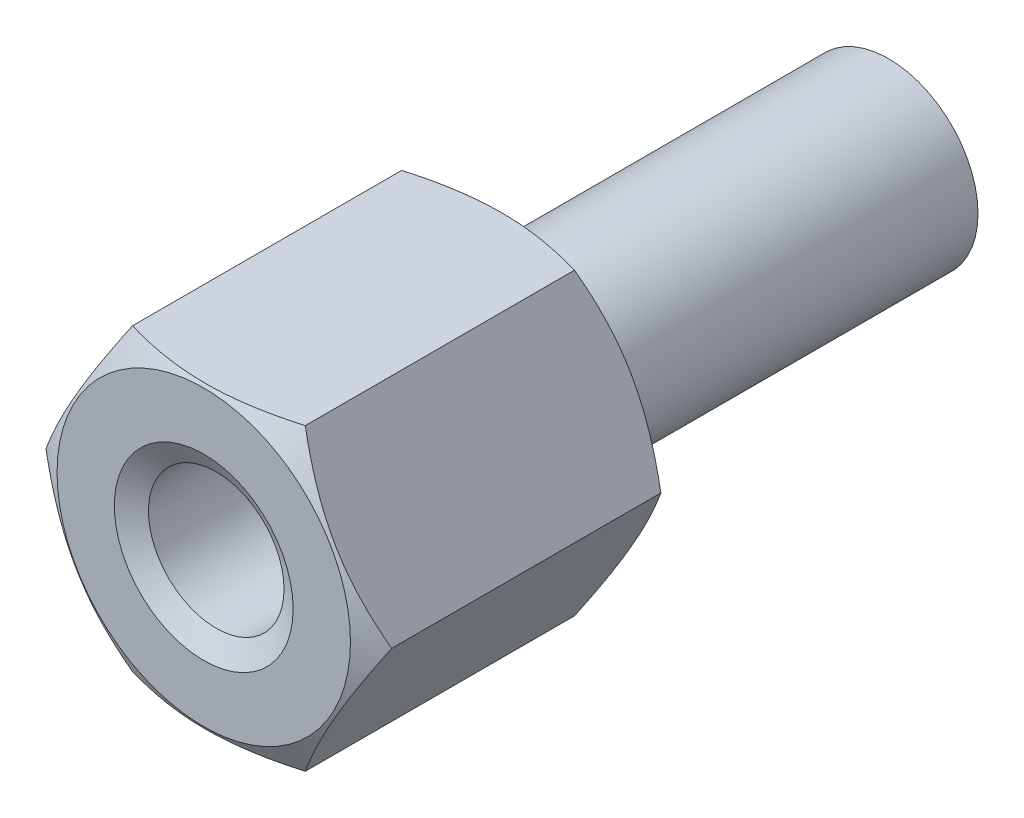
ISO-10303-21;
HEADER;
FILE_DESCRIPTION(('STEP AP214'),'2;1');
FILE_NAME('part.step','',(''),(''),'','','');
FILE_SCHEMA(('AUTOMOTIVE_DESIGN { 1 0 10303 214 1 1 1 1 }'));
ENDSEC;
DATA;
#1=APPLICATION_CONTEXT('core data for automotive mechanical design processes');
#2=APPLICATION_PROTOCOL_DEFINITION('international standard','automotive_design',2000,#1);
#3=PRODUCT_CONTEXT('',#1,'mechanical');
#4=PRODUCT('Part','Part','',(#3));
#5=PRODUCT_RELATED_PRODUCT_CATEGORY('part','',(#4));
#6=PRODUCT_DEFINITION_FORMATION('','',#4);
#7=PRODUCT_DEFINITION_CONTEXT('part definition',#1,'design');
#8=PRODUCT_DEFINITION('design','',#6,#7);
#9=PRODUCT_DEFINITION_SHAPE('','',#8);
#10=(LENGTH_UNIT() NAMED_UNIT(*) SI_UNIT(.MILLI.,.METRE.));
#11=(NAMED_UNIT(*) PLANE_ANGLE_UNIT() SI_UNIT($,.RADIAN.));
#12=(NAMED_UNIT(*) SI_UNIT($,.STERADIAN.) SOLID_ANGLE_UNIT());
#13=UNCERTAINTY_MEASURE_WITH_UNIT(LENGTH_MEASURE(1.E-05),#10,'distance_accuracy_value','');
#14=(GEOMETRIC_REPRESENTATION_CONTEXT(3) GLOBAL_UNCERTAINTY_ASSIGNED_CONTEXT((#13)) GLOBAL_UNIT_ASSIGNED_CONTEXT((#10,
#11,#12)) REPRESENTATION_CONTEXT('',''));
#15=CARTESIAN_POINT('',(0.,0.,0.));
#16=DIRECTION('',(0.,0.,1.));
#17=DIRECTION('',(1.,0.,0.));
#18=AXIS2_PLACEMENT_3D('',#15,#16,#17);
#19=CARTESIAN_POINT('',(0.,0.,1.46067780008253));
#20=DIRECTION('',(0.,0.,1.));
#21=DIRECTION('',(1.,0.,0.));
#22=AXIS2_PLACEMENT_3D('',#19,#20,#21);
#23=CONICAL_SURFACE('',#22,1.07823000007554,1.02974425863595);
#24=CARTESIAN_POINT('',(-5.6843418860808E-11,0.,0.812811854729034));
#25=VERTEX_POINT('',#24);
#26=VERTEX_LOOP('',#25);
#27=FACE_BOUND('',#26,.T.);
#28=CARTESIAN_POINT('',(3.49148133884313E-12,0.,1.46067780000003));
#29=DIRECTION('',(0.,0.,1.));
#30=DIRECTION('',(1.,0.,0.));
#31=AXIS2_PLACEMENT_3D('',#28,#29,#30);
#32=CIRCLE('',#31,1.07823);
#33=CARTESIAN_POINT('',(1.07823000000349,0.,1.46067780000003));
#34=VERTEX_POINT('',#33);
#35=EDGE_CURVE('E230',#34,#34,#32,.T.);
#36=ORIENTED_EDGE('',*,*,#35,.T.);
#37=EDGE_LOOP('',(#36));
#38=FACE_BOUND('',#37,.T.);
#39=ADVANCED_FACE('F17',(#27,#38),#23,.F.);
#40=CARTESIAN_POINT('',(3.49148133884313E-12,0.,1000.));
#41=DIRECTION('',(0.,0.,1.));
#42=DIRECTION('',(1.,0.,0.));
#43=AXIS2_PLACEMENT_3D('',#40,#41,#42);
#44=CYLINDRICAL_SURFACE('',#43,1.07823);
#45=ORIENTED_EDGE('',*,*,#35,.F.);
#46=EDGE_LOOP('',(#45));
#47=FACE_BOUND('',#46,.T.);
#48=CARTESIAN_POINT('',(0.,0.,2.02379335786418));
#49=DIRECTION('',(0.,0.,1.));
#50=DIRECTION('',(1.,0.,0.));
#51=AXIS2_PLACEMENT_3D('',#48,#49,#50);
#52=CIRCLE('',#51,1.07822999996187);
#53=CARTESIAN_POINT('',(1.07822999996188,0.,2.02379335786418));
#54=VERTEX_POINT('',#53);
#55=EDGE_CURVE('E227',#54,#54,#52,.T.);
#56=ORIENTED_EDGE('',*,*,#55,.T.);
#57=EDGE_LOOP('',(#56));
#58=FACE_BOUND('',#57,.T.);
#59=ADVANCED_FACE('F396',(#47,#58),#44,.F.);
#60=CARTESIAN_POINT('',(0.,0.,2.22249999995939));
#61=DIRECTION('',(0.,0.,1.));
#62=DIRECTION('',(1.,0.,0.));
#63=AXIS2_PLACEMENT_3D('',#60,#61,#62);
#64=CONICAL_SURFACE('',#63,1.42239999996718,1.04719755131613);
#65=ORIENTED_EDGE('',*,*,#55,.F.);
#66=EDGE_LOOP('',(#65));
#67=FACE_BOUND('',#66,.T.);
#68=CARTESIAN_POINT('',(0.,0.,2.22250000001622));
#69=DIRECTION('',(0.,0.,-1.));
#70=DIRECTION('',(-1.,0.,0.));
#71=AXIS2_PLACEMENT_3D('',#68,#69,#70);
#72=CIRCLE('',#71,1.42239999996719);
#73=CARTESIAN_POINT('',(-1.42239999996718,0.,2.22250000001623));
#74=VERTEX_POINT('',#73);
#75=EDGE_CURVE('E220',#74,#74,#72,.F.);
#76=ORIENTED_EDGE('',*,*,#75,.T.);
#77=EDGE_LOOP('',(#76));
#78=FACE_BOUND('',#77,.T.);
#79=ADVANCED_FACE('F386',(#67,#78),#64,.F.);
#80=CARTESIAN_POINT('',(0.,0.,2.22250000007306));
#81=DIRECTION('',(0.,0.,-1.));
#82=DIRECTION('',(-1.,0.,0.));
#83=AXIS2_PLACEMENT_3D('',#80,#81,#82);
#84=CONICAL_SURFACE('',#83,1.42239999991035,1.04719755124461);
#85=CARTESIAN_POINT('',(3.49148133884313E-12,0.,2.42120664214696));
#86=DIRECTION('',(0.,0.,1.));
#87=DIRECTION('',(1.,0.,0.));
#88=AXIS2_PLACEMENT_3D('',#85,#86,#87);
#89=CIRCLE('',#88,1.07823000000001);
#90=CARTESIAN_POINT('',(1.0782300000035,0.,2.42120664214696));
#91=VERTEX_POINT('',#90);
#92=EDGE_CURVE('E215',#91,#91,#89,.T.);
#93=ORIENTED_EDGE('',*,*,#92,.T.);
#94=EDGE_LOOP('',(#93));
#95=FACE_BOUND('',#94,.T.);
#96=ORIENTED_EDGE('',*,*,#75,.F.);
#97=EDGE_LOOP('',(#96));
#98=FACE_BOUND('',#97,.T.);
#99=ADVANCED_FACE('F376',(#95,#98),#84,.F.);
#100=CARTESIAN_POINT('',(3.49148133884313E-12,0.,1000.));
#101=DIRECTION('',(0.,0.,1.));
#102=DIRECTION('',(1.,0.,0.));
#103=AXIS2_PLACEMENT_3D('',#100,#101,#102);
#104=CYLINDRICAL_SURFACE('',#103,1.07823000000001);
#105=ORIENTED_EDGE('',*,*,#92,.F.);
#106=EDGE_LOOP('',(#105));
#107=FACE_BOUND('',#106,.T.);
#108=CARTESIAN_POINT('',(0.,0.,4.56379335787461));
#109=DIRECTION('',(0.,0.,1.));
#110=DIRECTION('',(1.,0.,0.));
#111=AXIS2_PLACEMENT_3D('',#108,#109,#110);
#112=CIRCLE('',#111,1.07822999996186);
#113=CARTESIAN_POINT('',(1.07822999996188,0.,4.5637933578746));
#114=VERTEX_POINT('',#113);
#115=EDGE_CURVE('E211',#114,#114,#112,.T.);
#116=ORIENTED_EDGE('',*,*,#115,.T.);
#117=EDGE_LOOP('',(#116));
#118=FACE_BOUND('',#117,.T.);
#119=ADVANCED_FACE('F367',(#107,#118),#104,.F.);
#120=CARTESIAN_POINT('',(0.,0.,4.76250000002665));
#121=DIRECTION('',(0.,0.,1.));
#122=DIRECTION('',(1.,0.,0.));
#123=AXIS2_PLACEMENT_3D('',#120,#121,#122);
#124=CONICAL_SURFACE('',#123,1.42239999996717,1.04719755121142);
#125=ORIENTED_EDGE('',*,*,#115,.F.);
#126=EDGE_LOOP('',(#125));
#127=FACE_BOUND('',#126,.T.);
#128=CARTESIAN_POINT('',(0.,0.,4.76249999996103));
#129=DIRECTION('',(0.,0.,1.));
#130=DIRECTION('',(1.,0.,0.));
#131=AXIS2_PLACEMENT_3D('',#128,#129,#130);
#132=CIRCLE('',#131,1.4223999998535);
#133=CARTESIAN_POINT('',(1.42239999985351,0.,4.76249999996102));
#134=VERTEX_POINT('',#133);
#135=EDGE_CURVE('E20',#134,#134,#132,.F.);
#136=ORIENTED_EDGE('',*,*,#135,.F.);
#137=EDGE_LOOP('',(#136));
#138=FACE_BOUND('',#137,.T.);
#139=ADVANCED_FACE('F359',(#127,#138),#124,.F.);
#140=CARTESIAN_POINT('',(0.,0.,4.7625));
#141=DIRECTION('',(0.,0.,1.));
#142=DIRECTION('',(1.,0.,0.));
#143=AXIS2_PLACEMENT_3D('',#140,#141,#142);
#144=PLANE('',#143);
#145=ORIENTED_EDGE('',*,*,#135,.T.);
#146=EDGE_LOOP('',(#145));
#147=FACE_BOUND('',#146,.T.);
#148=CARTESIAN_POINT('',(0.,0.,4.76249999994342));
#149=DIRECTION('',(0.,0.,-1.));
#150=DIRECTION('',(-1.,0.,0.));
#151=AXIS2_PLACEMENT_3D('',#148,#149,#150);
#152=CIRCLE('',#151,2.33362500006253);
#153=CARTESIAN_POINT('',(-2.33362500006251,0.,4.76249999994342));
#154=VERTEX_POINT('',#153);
#155=EDGE_CURVE('E206',#154,#154,#152,.T.);
#156=ORIENTED_EDGE('',*,*,#155,.F.);
#157=EDGE_LOOP('',(#156));
#158=FACE_BOUND('',#157,.T.);
#159=ADVANCED_FACE('F178',(#147,#158),#144,.T.);
#160=CARTESIAN_POINT('',(0.,0.,4.52087793610189));
#161=DIRECTION('',(0.,0.,-1.));
#162=DIRECTION('',(-1.,0.,0.));
#163=AXIS2_PLACEMENT_3D('',#160,#161,#162);
#164=CONICAL_SURFACE('',#163,2.75212669089343,1.04719755122529);
#165=CARTESIAN_POINT('',(1.37481532850383,-2.38125000000687,4.52231902193078));
#166=CARTESIAN_POINT('',(1.43523013600946,-2.27660848387762,4.55720963851203));
#167=CARTESIAN_POINT('',(1.49616644327393,-2.17106370366993,4.5889408282539));
#168=CARTESIAN_POINT('',(1.61909412920159,-1.95814670598636,4.64432666692431));
#169=CARTESIAN_POINT('',(1.68108769134085,-1.85077070661899,4.66796172458124));
#170=CARTESIAN_POINT('',(1.80430656048059,-1.63734936481778,4.7047513957991));
#171=CARTESIAN_POINT('',(1.8655129139895,-1.53133685079431,4.71815089356114));
#172=CARTESIAN_POINT('',(1.98821346686974,-1.31881325908895,4.73414410611313));
#173=CARTESIAN_POINT('',(2.04970722056393,-1.21230295334249,4.73675106784322));
#174=CARTESIAN_POINT('',(2.16460170245123,-1.01329987320438,4.73131384520457));
#175=CARTESIAN_POINT('',(2.21801967149736,-0.920777236779334,4.72460467921036));
#176=CARTESIAN_POINT('',(2.32450760894597,-0.736334718725136,4.70334486075553));
#177=CARTESIAN_POINT('',(2.37757720931,-0.64441547455726,4.68878695309039));
#178=CARTESIAN_POINT('',(2.48428452195232,-0.459592987521613,4.65239500160878));
#179=CARTESIAN_POINT('',(2.53790873579309,-0.366713124633468,4.63040676666272));
#180=CARTESIAN_POINT('',(2.64435758964818,-0.182338301348986,4.58050276918312));
#181=CARTESIAN_POINT('',(2.69718359234336,-0.0908409807201559,4.55259872457628));
#182=CARTESIAN_POINT('',(2.74963065700989,-9.87708933523013E-12,4.52231902193636));
#183=B_SPLINE_CURVE_WITH_KNOTS('',3,(#165,#166,#167,#168,#169,#170,#171,#172,#173,#174,#175,
#176,#177,#178,#179,#180,#181,#182),.UNSPECIFIED.,.F.,.F.,(4,2,2,2,2,2,2,2,4),(0.,
0.377447188756246,0.755801388390488,1.12479249356597,1.49333055833174,1.81416457868512,
2.13529568072668,2.4635479317661,2.7911559622072),.UNSPECIFIED.);
#184=CARTESIAN_POINT('',(1.37481532850921,-2.38125000000343,4.52231902193095));
#185=VERTEX_POINT('',#184);
#186=CARTESIAN_POINT('',(2.7496306569603,5.98323541491522E-12,4.52231902196218));
#187=VERTEX_POINT('',#186);
#188=EDGE_CURVE('E201',#185,#187,#183,.T.);
#189=ORIENTED_EDGE('',*,*,#188,.T.);
#190=CARTESIAN_POINT('',(2.74963065700994,9.80280419179259E-12,4.52231902193634));
#191=CARTESIAN_POINT('',(2.68921584950446,0.104641516138778,4.55720963851714));
#192=CARTESIAN_POINT('',(2.62827954224015,0.210186296346201,4.58894082825852));
#193=CARTESIAN_POINT('',(2.50535185631282,0.423103294029193,4.64432666692793));
#194=CARTESIAN_POINT('',(2.44335829417374,0.530479293396268,4.66796172458434));
#195=CARTESIAN_POINT('',(2.32013942503435,0.743900635196872,4.70475139580116));
#196=CARTESIAN_POINT('',(2.25893307152561,0.84991314922003,4.71815089356269));
#197=CARTESIAN_POINT('',(2.13623251864575,1.06243674092474,4.73414410611369));
#198=CARTESIAN_POINT('',(2.07473876495176,1.16894704667085,4.7367510678433));
#199=CARTESIAN_POINT('',(1.95984428306451,1.36795012680887,4.73131384520381));
#200=CARTESIAN_POINT('',(1.90642631401823,1.46047276323417,4.7246046792092));
#201=CARTESIAN_POINT('',(1.79993837656934,1.64491528128886,4.70334486075352));
#202=CARTESIAN_POINT('',(1.74686877620518,1.73683452545697,4.68878695308796));
#203=CARTESIAN_POINT('',(1.64016146356259,1.92165701249307,4.6523950016055));
#204=CARTESIAN_POINT('',(1.58653724972169,2.01453687538144,4.63040676665903));
#205=CARTESIAN_POINT('',(1.48008839586636,2.19891169866635,4.58050276917862));
#206=CARTESIAN_POINT('',(1.42726239317105,2.29040901929539,4.5525987245714));
#207=CARTESIAN_POINT('',(1.3748153285044,2.38125000000588,4.52231902193111));
#208=B_SPLINE_CURVE_WITH_KNOTS('',3,(#190,#191,#192,#193,#194,#195,#196,#197,#198,#199,#200,
#201,#202,#203,#204,#205,#206,#207),.UNSPECIFIED.,.F.,.F.,(4,2,2,2,2,2,2,2,4),(0.,
0.377447188754965,0.755801388387895,1.12479249356214,1.4933305583267,1.81416457868104,
2.13529568072357,2.46354793176401,2.7911559622061),.UNSPECIFIED.);
#209=CARTESIAN_POINT('',(1.37481532851006,2.38125000000294,4.52231902193095));
#210=VERTEX_POINT('',#209);
#211=EDGE_CURVE('E159',#187,#210,#208,.T.);
#212=ORIENTED_EDGE('',*,*,#211,.T.);
#213=CARTESIAN_POINT('',(1.37481532851573,2.38125,4.52231902193078));
#214=CARTESIAN_POINT('',(1.25398571350446,2.38125,4.55720963851204));
#215=CARTESIAN_POINT('',(1.13211309897551,2.38125,4.5889408282539));
#216=CARTESIAN_POINT('',(0.886257727120188,2.38125,4.64432666692432));
#217=CARTESIAN_POINT('',(0.762270602841664,2.38125,4.66796172458124));
#218=CARTESIAN_POINT('',(0.51583286456218,2.38125,4.7047513957991));
#219=CARTESIAN_POINT('',(0.393420157544351,2.38125,4.71815089356114));
#220=CARTESIAN_POINT('',(0.148019051783893,2.38125,4.73414410611313));
#221=CARTESIAN_POINT('',(0.0250315443955297,2.38125,4.73675106784322));
#222=CARTESIAN_POINT('',(-0.204757419380657,2.38125,4.73131384520453));
#223=CARTESIAN_POINT('',(-0.311593357474517,2.38125,4.72460467921016));
#224=CARTESIAN_POINT('',(-0.524569232374871,2.38125,4.70334486075478));
#225=CARTESIAN_POINT('',(-0.630708433104492,2.38125,4.68878695308926));
#226=CARTESIAN_POINT('',(-0.844123058392303,2.38125,4.65239500160668));
#227=CARTESIAN_POINT('',(-0.95137148607543,2.38125,4.63040676666004));
#228=CARTESIAN_POINT('',(-1.16426919378873,2.38125,4.58050276917914));
#229=CARTESIAN_POINT('',(-1.26992119918064,2.38125,4.5525987245716));
#230=CARTESIAN_POINT('',(-1.37481532851521,2.38125,4.52231902193093));
#231=B_SPLINE_CURVE_WITH_KNOTS('',3,(#213,#214,#215,#216,#217,#218,#219,#220,#221,#222,#223,
#224,#225,#226,#227,#228,#229,#230),.UNSPECIFIED.,.F.,.F.,(4,2,2,2,2,2,2,2,4),(0.,
0.377447188756264,0.755801388390528,1.12479249356599,1.49333055833174,1.81416457868988,
2.13529568073623,2.46354793178069,2.79115596222678),.UNSPECIFIED.);
#232=CARTESIAN_POINT('',(-1.37481532850966,2.38125000000319,4.52231902193094));
#233=VERTEX_POINT('',#232);
#234=EDGE_CURVE('E167',#210,#233,#231,.T.);
#235=ORIENTED_EDGE('',*,*,#234,.T.);
#236=CARTESIAN_POINT('',(-1.37481532850411,2.38125000000638,4.52231902193094));
#237=CARTESIAN_POINT('',(-1.43523013600974,2.27660848387713,4.55720963851219));
#238=CARTESIAN_POINT('',(-1.49616644327422,2.17106370366943,4.58894082825404));
#239=CARTESIAN_POINT('',(-1.61909412920188,1.95814670598585,4.64432666692443));
#240=CARTESIAN_POINT('',(-1.68108769134114,1.85077070661847,4.66796172458134));
#241=CARTESIAN_POINT('',(-1.80430656048087,1.63734936481727,4.70475139579917));
#242=CARTESIAN_POINT('',(-1.86551291398978,1.53133685079383,4.71815089356119));
#243=CARTESIAN_POINT('',(-1.98821346686999,1.31881325908851,4.73414410611315));
#244=CARTESIAN_POINT('',(-2.04970722056416,1.21230295334208,4.73675106784322));
#245=CARTESIAN_POINT('',(-2.1646017024533,1.01329987320079,4.73131384520445));
#246=CARTESIAN_POINT('',(-2.21801967150128,0.920777236772545,4.72460467920986));
#247=CARTESIAN_POINT('',(-2.32450760895355,0.736334718712006,4.70334486075373));
#248=CARTESIAN_POINT('',(-2.37757720931939,0.644415474540985,4.68878695308769));
#249=CARTESIAN_POINT('',(-2.48428452196539,0.459592987498977,4.65239500160381));
#250=CARTESIAN_POINT('',(-2.53790873580801,0.366713124607618,4.63040676665639));
#251=CARTESIAN_POINT('',(-2.64435758966674,0.182338301316826,4.58050276917375));
#252=CARTESIAN_POINT('',(-2.69718359236371,0.0908409806848994,4.55259872456526));
#253=CARTESIAN_POINT('',(-2.74963065703201,-2.84332365489293E-11,4.52231902192359));
#254=B_SPLINE_CURVE_WITH_KNOTS('',3,(#236,#237,#238,#239,#240,#241,#242,#243,#244,#245,#246,
#247,#248,#249,#250,#251,#252,#253),.UNSPECIFIED.,.F.,.F.,(4,2,2,2,2,2,2,2,4),(0.,
0.377447188756254,0.75580138839051,1.12479249356591,1.4933305583316,1.81416457869607,
2.13529568074878,2.46354793179991,2.79115596225264),.UNSPECIFIED.);
#255=CARTESIAN_POINT('',(-2.74963065707989,-1.1535152173725E-11,4.52231902184508));
#256=VERTEX_POINT('',#255);
#257=EDGE_CURVE('E87',#233,#256,#254,.T.);
#258=ORIENTED_EDGE('',*,*,#257,.T.);
#259=CARTESIAN_POINT('',(-2.74963065701171,2.0348617559065E-11,4.52231902191968));
#260=CARTESIAN_POINT('',(-2.68921584951381,-0.104641516112862,4.55720963850668));
#261=CARTESIAN_POINT('',(-2.62827954225222,-0.210186296322674,4.58894082825114));
#262=CARTESIAN_POINT('',(-2.50535185632611,-0.423103294008789,4.64432666692389));
#263=CARTESIAN_POINT('',(-2.44335829418549,-0.530479293376593,4.66796172458055));
#264=CARTESIAN_POINT('',(-2.32013942504428,-0.743900635178984,4.70475139579847));
#265=CARTESIAN_POINT('',(-2.25893307153522,-0.849913149203186,4.71815089356083));
#266=CARTESIAN_POINT('',(-2.13623251865439,-1.06243674090994,4.73414410611316));
#267=CARTESIAN_POINT('',(-2.07473876495974,-1.16894704665706,4.73675106784326));
#268=CARTESIAN_POINT('',(-1.95984428307127,-1.36795012679712,4.73131384520451));
#269=CARTESIAN_POINT('',(-1.90642631402441,-1.46047276322345,4.72460467921015));
#270=CARTESIAN_POINT('',(-1.79993837657436,-1.64491528128017,4.7033448607548));
#271=CARTESIAN_POINT('',(-1.74686877620961,-1.73683452544928,4.68878695308931));
#272=CARTESIAN_POINT('',(-1.64016146356579,-1.92165701248751,4.65239500160677));
#273=CARTESIAN_POINT('',(-1.58653724972425,-2.014536875377,4.63040676666016));
#274=CARTESIAN_POINT('',(-1.48008839586763,-2.19891169866415,4.5805027691793));
#275=CARTESIAN_POINT('',(-1.42726239317168,-2.2904090192943,4.55259872457176));
#276=CARTESIAN_POINT('',(-1.3748153285044,-2.38125000000588,4.52231902193111));
#277=B_SPLINE_CURVE_WITH_KNOTS('',3,(#259,#260,#261,#262,#263,#264,#265,#266,#267,#268,#269,
#270,#271,#272,#273,#274,#275,#276),.UNSPECIFIED.,.F.,.F.,(4,2,2,2,2,2,2,2,4),(0.,
0.377447188759317,0.755801388396387,1.12479249357414,1.49333055834229,1.81416457870009,
2.13529568074604,2.46354793179036,2.7911559622364),.UNSPECIFIED.);
#278=CARTESIAN_POINT('',(-1.37481532851006,-2.38125000000294,4.52231902193095));
#279=VERTEX_POINT('',#278);
#280=EDGE_CURVE('E88',#256,#279,#277,.T.);
#281=ORIENTED_EDGE('',*,*,#280,.T.);
#282=CARTESIAN_POINT('',(-1.37481532851572,-2.38125,4.52231902193078));
#283=CARTESIAN_POINT('',(-1.25398571350445,-2.38125,4.55720963851204));
#284=CARTESIAN_POINT('',(-1.1321130989755,-2.38125,4.5889408282539));
#285=CARTESIAN_POINT('',(-0.886257727120183,-2.38125,4.64432666692432));
#286=CARTESIAN_POINT('',(-0.762270602841659,-2.38125,4.66796172458124));
#287=CARTESIAN_POINT('',(-0.515832864562174,-2.38125,4.7047513957991));
#288=CARTESIAN_POINT('',(-0.393420157544344,-2.38125,4.71815089356114));
#289=CARTESIAN_POINT('',(-0.148019051783884,-2.38125,4.73414410611313));
#290=CARTESIAN_POINT('',(-0.02503154439552,-2.38125,4.73675106784322));
#291=CARTESIAN_POINT('',(0.204757419380613,-2.38125,4.73131384520453));
#292=CARTESIAN_POINT('',(0.31159335747442,-2.38125,4.72460467921017));
#293=CARTESIAN_POINT('',(0.524569232374666,-2.38125,4.7033448607548));
#294=CARTESIAN_POINT('',(0.630708433104234,-2.38125,4.68878695308929));
#295=CARTESIAN_POINT('',(0.844123058391937,-2.38125,4.65239500160675));
#296=CARTESIAN_POINT('',(0.95137148607501,-2.38125,4.63040676666013));
#297=CARTESIAN_POINT('',(1.16426919378821,-2.38125,4.58050276917927));
#298=CARTESIAN_POINT('',(1.26992119918006,-2.38125,4.55259872457175));
#299=CARTESIAN_POINT('',(1.37481532851458,-2.38125,4.52231902193111));
#300=B_SPLINE_CURVE_WITH_KNOTS('',3,(#282,#283,#284,#285,#286,#287,#288,#289,#290,#291,#292,
#293,#294,#295,#296,#297,#298,#299),.UNSPECIFIED.,.F.,.F.,(4,2,2,2,2,2,2,2,4),(0.,
0.377447188756265,0.755801388390531,1.12479249356599,1.49333055833175,1.81416457868973,
2.13529568073592,2.4635479317802,2.79115596222612),.UNSPECIFIED.);
#301=EDGE_CURVE('E63',#279,#185,#300,.T.);
#302=ORIENTED_EDGE('',*,*,#301,.T.);
#303=EDGE_LOOP('',(#189,#212,#235,#258,#281,#302));
#304=FACE_BOUND('',#303,.T.);
#305=ORIENTED_EDGE('',*,*,#155,.T.);
#306=EDGE_LOOP('',(#305));
#307=FACE_BOUND('',#306,.T.);
#308=ADVANCED_FACE('F173',(#304,#307),#164,.T.);
#309=CARTESIAN_POINT('',(1.3748153285078,-2.38125,4.7625));
#310=DIRECTION('',(-0.866025403784439,0.5,0.));
#311=DIRECTION('',(-0.5,-0.866025403784439,0.));
#312=AXIS2_PLACEMENT_3D('',#309,#310,#311);
#313=PLANE('',#312);
#314=DIRECTION('',(0.,0.,1.));
#315=VECTOR('',#314,1.);
#316=CARTESIAN_POINT('',(2.74963065701099,7.97753497567421E-12,4.7625));
#317=LINE('',#316,#315);
#318=CARTESIAN_POINT('',(2.74963065700102,1.99438373859621E-12,0.240180978016528));
#319=VERTEX_POINT('',#318);
#320=EDGE_CURVE('E166',#319,#187,#317,.T.);
#321=ORIENTED_EDGE('',*,*,#320,.T.);
#322=ORIENTED_EDGE('',*,*,#188,.F.);
#323=DIRECTION('',(0.,0.,1.));
#324=VECTOR('',#323,1.);
#325=CARTESIAN_POINT('',(1.37481532850532,-2.38125,4.7625));
#326=LINE('',#325,#324);
#327=CARTESIAN_POINT('',(1.37481537617074,-2.38125,0.240180991819275));
#328=VERTEX_POINT('',#327);
#329=EDGE_CURVE('E223',#185,#328,#326,.F.);
#330=ORIENTED_EDGE('',*,*,#329,.T.);
#331=CARTESIAN_POINT('',(2.74963065698386,-2.23408346329614E-11,0.240180978060676));
#332=CARTESIAN_POINT('',(2.68921584950525,-0.104641516125692,0.205290361481467));
#333=CARTESIAN_POINT('',(2.62827954226212,-0.210186296304998,0.173559171744014));
#334=CARTESIAN_POINT('',(2.50535185637474,-0.423103293925097,0.118173333082303));
#335=CARTESIAN_POINT('',(2.44335829425443,-0.530479293257331,0.0945382754293683));
#336=CARTESIAN_POINT('',(2.32013942511602,-0.743900635054584,0.0577486042002292));
#337=CARTESIAN_POINT('',(2.25893307158898,-0.849913149110041,0.0443491064290708));
#338=CARTESIAN_POINT('',(2.13623251866887,-1.0624367408849,0.0283558938674659));
#339=CARTESIAN_POINT('',(2.07473876495293,-1.16894704666887,0.0257489321371782));
#340=CARTESIAN_POINT('',(1.95984428762125,-1.36795011891632,0.0311861545607302));
#341=CARTESIAN_POINT('',(1.90642632314264,-1.46047274743021,0.0378953196220076));
#342=CARTESIAN_POINT('',(1.79993839475328,-1.64491524979337,0.0591551349254881));
#343=CARTESIAN_POINT('',(1.74686879888078,-1.73683448618167,0.0737130403691414));
#344=CARTESIAN_POINT('',(1.64016149532538,-1.92165695747829,0.110104986310912));
#345=CARTESIAN_POINT('',(1.58653728607556,-2.01453681241469,0.13209321789847));
#346=CARTESIAN_POINT('',(1.48008844123541,-2.19891162008485,0.181997207930283));
#347=CARTESIAN_POINT('',(1.42726244296482,-2.29040893305006,0.209901248452271));
#348=CARTESIAN_POINT('',(1.37481538266088,-2.38124990620411,0.240180946794873));
#349=B_SPLINE_CURVE_WITH_KNOTS('',3,(#331,#332,#333,#334,#335,#336,#337,#338,#339,#340,#341,
#342,#343,#344,#345,#346,#347,#348),.UNSPECIFIED.,.F.,.F.,(4,2,2,2,2,2,2,2,4),(0.,
0.377447188650636,0.755801388164953,1.12479249345407,1.49333055834378,1.8141645512535,
2.13529562574983,2.46354784781481,2.79115584950207),.UNSPECIFIED.);
#350=EDGE_CURVE('E35',#319,#328,#349,.T.);
#351=ORIENTED_EDGE('',*,*,#350,.F.);
#352=EDGE_LOOP('',(#321,#322,#330,#351));
#353=FACE_BOUND('',#352,.T.);
#354=ADVANCED_FACE('F177',(#353),#313,.F.);
#355=CARTESIAN_POINT('',(-1.37481532850779,-2.38125,4.7625));
#356=DIRECTION('',(0.,1.,0.));
#357=DIRECTION('',(-1.,0.,0.));
#358=AXIS2_PLACEMENT_3D('',#355,#356,#357);
#359=PLANE('',#358);
#360=ORIENTED_EDGE('',*,*,#329,.F.);
#361=ORIENTED_EDGE('',*,*,#301,.F.);
#362=DIRECTION('',(0.,0.,1.));
#363=VECTOR('',#362,1.);
#364=CARTESIAN_POINT('',(-1.37481532850903,-2.38124999999785,4.7625));
#365=LINE('',#364,#363);
#366=CARTESIAN_POINT('',(-1.37481530469018,-2.38125004125331,0.240180991811282));
#367=VERTEX_POINT('',#366);
#368=EDGE_CURVE('E82',#279,#367,#365,.F.);
#369=ORIENTED_EDGE('',*,*,#368,.T.);
#370=CARTESIAN_POINT('',(1.37481542383616,-2.38125,0.240181005579098));
#371=CARTESIAN_POINT('',(1.25398580728187,-2.38125,0.205290386754302));
#372=CARTESIAN_POINT('',(1.13211319120023,-2.38125,0.173559194625385));
#373=CARTESIAN_POINT('',(0.886257816090579,-2.38125,0.118173350992264));
#374=CARTESIAN_POINT('',(0.762270690109504,-2.38125,0.0945382907622425));
#375=CARTESIAN_POINT('',(0.515832948351923,-2.38125,0.0577486144221395));
#376=CARTESIAN_POINT('',(0.393420239563842,-2.38125,0.0443491141069867));
#377=CARTESIAN_POINT('',(0.148019130053474,-2.38125,0.0283558966340724));
#378=CARTESIAN_POINT('',(0.025031620685819,-2.38125,0.0257489325346501));
#379=CARTESIAN_POINT('',(-0.204757342072546,-2.38125,0.0311861510243268));
#380=CARTESIAN_POINT('',(-0.311593277156512,-2.38125,0.0378953148048352));
#381=CARTESIAN_POINT('',(-0.524569146208676,-2.38125,0.0591551285716584));
#382=CARTESIAN_POINT('',(-0.630708344100228,-2.38125,0.0737130337616674));
#383=CARTESIAN_POINT('',(-0.844122963722691,-2.38125,0.110104980141274));
#384=CARTESIAN_POINT('',(-0.951371388582829,-2.38125,0.132093212453365));
#385=CARTESIAN_POINT('',(-1.16426909078817,-2.38125,0.181997204690385));
#386=CARTESIAN_POINT('',(-1.26992109349456,-2.38125,0.20990124669001));
#387=CARTESIAN_POINT('',(-1.3748152201705,-2.38125,0.240180946785896));
#388=B_SPLINE_CURVE_WITH_KNOTS('',3,(#370,#371,#372,#373,#374,#375,#376,#377,#378,#379,#380,
#381,#382,#383,#384,#385,#386,#387),.UNSPECIFIED.,.F.,.F.,(4,2,2,2,2,2,2,2,4),(0.,
0.377447195080435,0.755801401191275,1.12479251248186,1.49333058331065,1.81416459426107,
2.13529568686784,2.46354792802463,2.79115594868164),.UNSPECIFIED.);
#389=EDGE_CURVE('E86',#328,#367,#388,.T.);
#390=ORIENTED_EDGE('',*,*,#389,.F.);
#391=EDGE_LOOP('',(#360,#361,#369,#390));
#392=FACE_BOUND('',#391,.T.);
#393=ADVANCED_FACE('F84',(#392),#359,.F.);
#394=CARTESIAN_POINT('',(-2.74963065701559,0.,4.7625));
#395=DIRECTION('',(0.866025403784438,0.5,0.));
#396=DIRECTION('',(-0.5,0.866025403784438,0.));
#397=AXIS2_PLACEMENT_3D('',#394,#395,#396);
#398=PLANE('',#397);
#399=ORIENTED_EDGE('',*,*,#368,.F.);
#400=ORIENTED_EDGE('',*,*,#280,.F.);
#401=DIRECTION('',(0.,0.,1.));
#402=VECTOR('',#401,1.);
#403=CARTESIAN_POINT('',(-2.74963065704223,-4.61406086949001E-11,4.7625));
#404=LINE('',#403,#402);
#405=CARTESIAN_POINT('',(-2.74963065696952,-3.46053723397896E-11,0.2401809779872));
#406=VERTEX_POINT('',#405);
#407=EDGE_CURVE('E76',#256,#406,#404,.F.);
#408=ORIENTED_EDGE('',*,*,#407,.T.);
#409=CARTESIAN_POINT('',(-1.37481528087133,-2.38125008250877,0.240181005563102));
#410=CARTESIAN_POINT('',(-1.43523008916562,-2.27660856501354,0.205290386729582));
#411=CARTESIAN_POINT('',(-1.49616639722379,-2.17106378343112,0.173559194593712));
#412=CARTESIAN_POINT('',(-1.61909408481606,-1.95814678286435,0.118173350951022));
#413=CARTESIAN_POINT('',(-1.68108764782672,-1.85077078198766,0.0945382907186937));
#414=CARTESIAN_POINT('',(-1.80430651870761,-1.63734943717069,0.0577486143933438));
#415=CARTESIAN_POINT('',(-1.86551287308314,-1.53133692164621,0.0443491140890688));
#416=CARTESIAN_POINT('',(-1.98821342779798,-1.31881332676321,0.0283558966302994));
#417=CARTESIAN_POINT('',(-2.04970718245997,-1.21230301934047,0.0257489325338524));
#418=CARTESIAN_POINT('',(-2.16460166839063,-1.01329993219907,0.0311861512440728));
#419=CARTESIAN_POINT('',(-2.21801964049612,-0.920777290475057,0.0378953159595284));
#420=CARTESIAN_POINT('',(-2.32450758407336,-0.736334761805752,0.0591551328808915));
#421=CARTESIAN_POINT('',(-2.3775771875066,-0.644415512321846,0.0737130402935377));
#422=CARTESIAN_POINT('',(-2.48428450639662,-0.459593014464889,0.110104992214536));
#423=CARTESIAN_POINT('',(-2.53790872341354,-0.366713146075469,0.132093227885504));
#424=CARTESIAN_POINT('',(-2.64435758352303,-0.182338311958045,0.181997227570428));
#425=CARTESIAN_POINT('',(-2.69718358929679,-0.090840985996973,0.209901273654637));
#426=CARTESIAN_POINT('',(-2.74963065699333,-3.85487186439722E-11,0.240180978047333));
#427=B_SPLINE_CURVE_WITH_KNOTS('',3,(#409,#410,#411,#412,#413,#414,#415,#416,#417,#418,#419,
#420,#421,#422,#423,#424,#425,#426),.UNSPECIFIED.,.F.,.F.,(4,2,2,2,2,2,2,2,4),(0.,
0.377447195186261,0.755801401416903,1.12479251259253,1.49333058329618,1.81416462166671,
2.13529574179504,2.46354801190253,2.7911560612898),.UNSPECIFIED.);
#428=EDGE_CURVE('E90',#367,#406,#427,.T.);
#429=ORIENTED_EDGE('',*,*,#428,.F.);
#430=EDGE_LOOP('',(#399,#400,#408,#429));
#431=FACE_BOUND('',#430,.T.);
#432=ADVANCED_FACE('F91',(#431),#398,.F.);
#433=CARTESIAN_POINT('',(-1.37481532850779,2.38125,4.7625));
#434=DIRECTION('',(0.866025403784439,-0.5,0.));
#435=DIRECTION('',(0.5,0.866025403784439,0.));
#436=AXIS2_PLACEMENT_3D('',#433,#434,#435);
#437=PLANE('',#436);
#438=ORIENTED_EDGE('',*,*,#407,.F.);
#439=ORIENTED_EDGE('',*,*,#257,.F.);
#440=DIRECTION('',(0.,0.,1.));
#441=VECTOR('',#440,1.);
#442=CARTESIAN_POINT('',(-1.37481532850614,2.38125,4.7625));
#443=LINE('',#442,#441);
#444=CARTESIAN_POINT('',(-1.37481537615582,2.38125,0.240180991814977));
#445=VERTEX_POINT('',#444);
#446=EDGE_CURVE('E462',#233,#445,#443,.F.);
#447=ORIENTED_EDGE('',*,*,#446,.T.);
#448=CARTESIAN_POINT('',(-2.7496306569778,3.35873109735827E-11,0.240180978056761));
#449=CARTESIAN_POINT('',(-2.68921584949908,0.10464151613664,0.205290361478011));
#450=CARTESIAN_POINT('',(-2.62827954225598,0.210186296315698,0.173559171740948));
#451=CARTESIAN_POINT('',(-2.50535185636878,0.42310329393533,0.118173333079959));
#452=CARTESIAN_POINT('',(-2.44335829424864,0.530479293267344,0.0945382754273561));
#453=CARTESIAN_POINT('',(-2.3201394251105,0.743900635064167,0.0577486041988874));
#454=CARTESIAN_POINT('',(-2.25893307158357,0.849913149119412,0.0443491064280699));
#455=CARTESIAN_POINT('',(-2.13623251866371,1.06243674089383,0.0283558938671168));
#456=CARTESIAN_POINT('',(-2.07473876494791,1.16894704667757,0.0257489321371402));
#457=CARTESIAN_POINT('',(-1.95984428761787,1.36795011892216,0.0311861545611547));
#458=CARTESIAN_POINT('',(-1.90642632314078,1.46047274743343,0.0378953196223739));
#459=CARTESIAN_POINT('',(-1.79993839475442,1.64491524979139,0.0591551349252906));
#460=CARTESIAN_POINT('',(-1.74686879888341,1.73683448617711,0.0737130403684373));
#461=CARTESIAN_POINT('',(-1.64016149533104,1.92165695746849,0.110104986308805));
#462=CARTESIAN_POINT('',(-1.58653728608275,2.01453681240223,0.132093217895451));
#463=CARTESIAN_POINT('',(-1.48008844124561,2.19891162006717,0.181997207925164));
#464=CARTESIAN_POINT('',(-1.4272624429765,2.29040893302982,0.209901248445965));
#465=CARTESIAN_POINT('',(-1.37481538267402,2.38124990618134,0.240180946787293));
#466=B_SPLINE_CURVE_WITH_KNOTS('',3,(#448,#449,#450,#451,#452,#453,#454,#455,#456,#457,#458,
#459,#460,#461,#462,#463,#464,#465),.UNSPECIFIED.,.F.,.F.,(4,2,2,2,2,2,2,2,4),(0.,
0.377447188649676,0.755801388163017,1.12479249345131,1.4933305583402,1.81416455124088,
2.13529562572816,2.46354784778359,2.79115584946137),.UNSPECIFIED.);
#467=EDGE_CURVE('E95',#406,#445,#466,.T.);
#468=ORIENTED_EDGE('',*,*,#467,.F.);
#469=EDGE_LOOP('',(#438,#439,#447,#468));
#470=FACE_BOUND('',#469,.T.);
#471=ADVANCED_FACE('F315',(#470),#437,.F.);
#472=CARTESIAN_POINT('',(1.3748153285078,2.38125,4.7625));
#473=DIRECTION('',(0.,-1.,0.));
#474=DIRECTION('',(1.,0.,0.));
#475=AXIS2_PLACEMENT_3D('',#472,#473,#474);
#476=PLANE('',#475);
#477=ORIENTED_EDGE('',*,*,#446,.F.);
#478=ORIENTED_EDGE('',*,*,#234,.F.);
#479=DIRECTION('',(0.,0.,1.));
#480=VECTOR('',#479,1.);
#481=CARTESIAN_POINT('',(1.37481532850904,2.38124999999786,4.7625));
#482=LINE('',#481,#480);
#483=CARTESIAN_POINT('',(1.37481530469013,2.38125004125341,0.240180991811304));
#484=VERTEX_POINT('',#483);
#485=EDGE_CURVE('E101',#210,#484,#482,.F.);
#486=ORIENTED_EDGE('',*,*,#485,.T.);
#487=CARTESIAN_POINT('',(-1.37481542380549,2.38125,0.240181005570254));
#488=CARTESIAN_POINT('',(-1.2539858072517,2.38125,0.205290386746181));
#489=CARTESIAN_POINT('',(-1.13211319117058,2.38125,0.173559194618033));
#490=CARTESIAN_POINT('',(-0.886257816061999,2.38125,0.118173350986511));
#491=CARTESIAN_POINT('',(-0.762270690081486,2.38125,0.0945382907573167));
#492=CARTESIAN_POINT('',(-0.515832948325025,2.38125,0.0577486144188556));
#493=CARTESIAN_POINT('',(-0.393420239537501,2.38125,0.0443491141045202));
#494=CARTESIAN_POINT('',(-0.148019130028314,2.38125,0.0283558966331836));
#495=CARTESIAN_POINT('',(-0.0250316206612824,2.38125,0.0257489325345223));
#496=CARTESIAN_POINT('',(0.20475734209447,2.38125,0.0311861510254622));
#497=CARTESIAN_POINT('',(0.311593277176457,2.38125,0.0378953148063809));
#498=CARTESIAN_POINT('',(0.524569146224656,2.38125,0.0591551285736935));
#499=CARTESIAN_POINT('',(0.630708344114222,2.38125,0.0737130337637809));
#500=CARTESIAN_POINT('',(0.844122963732643,2.38125,0.110104980143239));
#501=CARTESIAN_POINT('',(0.951371388590728,2.38125,0.132093212455093));
#502=CARTESIAN_POINT('',(1.16426909079202,2.38125,0.181997204691395));
#503=CARTESIAN_POINT('',(1.26992109349642,2.38125,0.20990124669054));
#504=CARTESIAN_POINT('',(1.3748152201704,2.38125,0.240180946785857));
#505=B_SPLINE_CURVE_WITH_KNOTS('',3,(#487,#488,#489,#490,#491,#492,#493,#494,#495,#496,#497,
#498,#499,#500,#501,#502,#503,#504),.UNSPECIFIED.,.F.,.F.,(4,2,2,2,2,2,2,2,4),(0.,
0.377447195078366,0.755801401187084,1.12479251247574,1.49333058330262,1.81416459424721,
2.13529568684813,2.46354792799875,2.79115594864963),.UNSPECIFIED.);
#506=EDGE_CURVE('E133',#445,#484,#505,.T.);
#507=ORIENTED_EDGE('',*,*,#506,.F.);
#508=EDGE_LOOP('',(#477,#478,#486,#507));
#509=FACE_BOUND('',#508,.T.);
#510=ADVANCED_FACE('F154',(#509),#476,.F.);
#511=CARTESIAN_POINT('',(2.7496306570156,0.,4.7625));
#512=DIRECTION('',(-0.866025403784438,-0.5,0.));
#513=DIRECTION('',(0.5,-0.866025403784438,0.));
#514=AXIS2_PLACEMENT_3D('',#511,#512,#513);
#515=PLANE('',#514);
#516=ORIENTED_EDGE('',*,*,#485,.F.);
#517=ORIENTED_EDGE('',*,*,#211,.F.);
#518=ORIENTED_EDGE('',*,*,#320,.F.);
#519=CARTESIAN_POINT('',(1.37481528087123,2.38125008250895,0.240181005563154));
#520=CARTESIAN_POINT('',(1.43523008916552,2.27660856501371,0.205290386729629));
#521=CARTESIAN_POINT('',(1.49616639722369,2.17106378343129,0.173559194593752));
#522=CARTESIAN_POINT('',(1.61909408481597,1.95814678286451,0.11817335095105));
#523=CARTESIAN_POINT('',(1.68108764782664,1.85077078198781,0.0945382907187152));
#524=CARTESIAN_POINT('',(1.80430651870753,1.63734943717084,0.0577486143933543));
#525=CARTESIAN_POINT('',(1.86551287308306,1.53133692164635,0.0443491140890742));
#526=CARTESIAN_POINT('',(1.9882134277979,1.31881332676336,0.0283558966302941));
#527=CARTESIAN_POINT('',(2.04970718245989,1.21230301934062,0.0257489325338415));
#528=CARTESIAN_POINT('',(2.16460166839088,1.01329993219865,0.0311861512440681));
#529=CARTESIAN_POINT('',(2.21801964049669,0.920777290474076,0.0378953159595857));
#530=CARTESIAN_POINT('',(2.32450758407458,0.736334761803657,0.0591551328811635));
#531=CARTESIAN_POINT('',(2.37757718750814,0.644415512319199,0.0737130402939628));
#532=CARTESIAN_POINT('',(2.48428450639879,0.459593014461125,0.110104992215346));
#533=CARTESIAN_POINT('',(2.53790872341605,0.366713146071141,0.132093227886549));
#534=CARTESIAN_POINT('',(2.64435758352618,0.182338311952608,0.181997227571995));
#535=CARTESIAN_POINT('',(2.69718358930025,0.0908409859909923,0.209901273656491));
#536=CARTESIAN_POINT('',(2.7496306569971,3.20313073496469E-11,0.240180978049488));
#537=B_SPLINE_CURVE_WITH_KNOTS('',3,(#519,#520,#521,#522,#523,#524,#525,#526,#527,#528,#529,
#530,#531,#532,#533,#534,#535,#536),.UNSPECIFIED.,.F.,.F.,(4,2,2,2,2,2,2,2,4),(0.,
0.377447195186284,0.755801401416949,1.12479251259258,1.49333058329624,1.81416462166871,
2.13529574179899,2.46354801190854,2.79115606129785),.UNSPECIFIED.);
#538=EDGE_CURVE('E143',#484,#319,#537,.T.);
#539=ORIENTED_EDGE('',*,*,#538,.F.);
#540=EDGE_LOOP('',(#516,#517,#518,#539));
#541=FACE_BOUND('',#540,.T.);
#542=ADVANCED_FACE('F151',(#541),#515,.F.);
#543=CARTESIAN_POINT('',(0.,0.,-6.35));
#544=DIRECTION('',(0.,0.,-1.));
#545=DIRECTION('',(-1.,0.,0.));
#546=AXIS2_PLACEMENT_3D('',#543,#544,#545);
#547=PLANE('',#546);
#548=CARTESIAN_POINT('',(0.,0.,-6.35000000002166));
#549=DIRECTION('',(0.,0.,1.));
#550=DIRECTION('',(1.,0.,0.));
#551=AXIS2_PLACEMENT_3D('',#548,#549,#550);
#552=CIRCLE('',#551,1.04393999987453);
#553=CARTESIAN_POINT('',(1.04393999987451,0.,-6.35000000002166));
#554=VERTEX_POINT('',#553);
#555=EDGE_CURVE('E149',#554,#554,#552,.T.);
#556=ORIENTED_EDGE('',*,*,#555,.F.);
#557=EDGE_LOOP('',(#556));
#558=FACE_BOUND('',#557,.T.);
#559=ADVANCED_FACE('F127',(#558),#547,.T.);
#560=CARTESIAN_POINT('',(0.,0.,0.241622073474455));
#561=DIRECTION('',(0.,0.,1.));
#562=DIRECTION('',(1.,0.,0.));
#563=AXIS2_PLACEMENT_3D('',#560,#561,#562);
#564=CONICAL_SURFACE('',#563,2.7521267074917,1.0471975511989);
#565=ORIENTED_EDGE('',*,*,#428,.T.);
#566=ORIENTED_EDGE('',*,*,#467,.T.);
#567=ORIENTED_EDGE('',*,*,#506,.T.);
#568=ORIENTED_EDGE('',*,*,#538,.T.);
#569=ORIENTED_EDGE('',*,*,#350,.T.);
#570=ORIENTED_EDGE('',*,*,#389,.T.);
#571=EDGE_LOOP('',(#565,#566,#567,#568,#569,#570));
#572=FACE_BOUND('',#571,.T.);
#573=CARTESIAN_POINT('',(0.,0.,-1.28909903585051E-10));
#574=DIRECTION('',(0.,0.,1.));
#575=DIRECTION('',(1.,0.,0.));
#576=AXIS2_PLACEMENT_3D('',#573,#574,#575);
#577=CIRCLE('',#576,2.33362499977829);
#578=CARTESIAN_POINT('',(2.33362499977829,0.,-1.2891806266669E-10));
#579=VERTEX_POINT('',#578);
#580=EDGE_CURVE('E232',#579,#579,#577,.T.);
#581=ORIENTED_EDGE('',*,*,#580,.T.);
#582=EDGE_LOOP('',(#581));
#583=FACE_BOUND('',#582,.T.);
#584=ADVANCED_FACE('F97',(#572,#583),#564,.T.);
#585=CARTESIAN_POINT('',(0.,0.,-6.13149601713303));
#586=DIRECTION('',(0.,0.,1.));
#587=DIRECTION('',(1.,0.,0.));
#588=AXIS2_PLACEMENT_3D('',#585,#586,#587);
#589=CONICAL_SURFACE('',#588,1.42239999991036,1.04719755121554);
#590=CARTESIAN_POINT('',(0.,0.,-6.1314960171226));
#591=DIRECTION('',(0.,0.,1.));
#592=DIRECTION('',(1.,0.,0.));
#593=AXIS2_PLACEMENT_3D('',#590,#591,#592);
#594=CIRCLE('',#593,1.4224);
#595=CARTESIAN_POINT('',(1.4224,0.,-6.1314960171226));
#596=VERTEX_POINT('',#595);
#597=EDGE_CURVE('E26',#596,#596,#594,.T.);
#598=ORIENTED_EDGE('',*,*,#597,.F.);
#599=EDGE_LOOP('',(#598));
#600=FACE_BOUND('',#599,.T.);
#601=ORIENTED_EDGE('',*,*,#555,.T.);
#602=EDGE_LOOP('',(#601));
#603=FACE_BOUND('',#602,.T.);
#604=ADVANCED_FACE('F126',(#600,#603),#589,.T.);
#605=CARTESIAN_POINT('',(0.,0.,0.));
#606=DIRECTION('',(0.,0.,1.));
#607=DIRECTION('',(1.,0.,0.));
#608=AXIS2_PLACEMENT_3D('',#605,#606,#607);
#609=PLANE('',#608);
#610=CARTESIAN_POINT('',(0.,0.,0.));
#611=DIRECTION('',(0.,0.,1.));
#612=DIRECTION('',(1.,0.,0.));
#613=AXIS2_PLACEMENT_3D('',#610,#611,#612);
#614=CIRCLE('',#613,1.4224);
#615=CARTESIAN_POINT('',(1.4224,0.,0.));
#616=VERTEX_POINT('',#615);
#617=EDGE_CURVE('E11',#616,#616,#614,.F.);
#618=ORIENTED_EDGE('',*,*,#617,.F.);
#619=EDGE_LOOP('',(#618));
#620=FACE_BOUND('',#619,.T.);
#621=ORIENTED_EDGE('',*,*,#580,.F.);
#622=EDGE_LOOP('',(#621));
#623=FACE_BOUND('',#622,.T.);
#624=ADVANCED_FACE('F247',(#620,#623),#609,.F.);
#625=CARTESIAN_POINT('',(0.,0.,-6.35));
#626=DIRECTION('',(0.,0.,1.));
#627=DIRECTION('',(1.,0.,0.));
#628=AXIS2_PLACEMENT_3D('',#625,#626,#627);
#629=CYLINDRICAL_SURFACE('',#628,1.4224);
#630=ORIENTED_EDGE('',*,*,#617,.T.);
#631=EDGE_LOOP('',(#630));
#632=FACE_BOUND('',#631,.T.);
#633=ORIENTED_EDGE('',*,*,#597,.T.);
#634=EDGE_LOOP('',(#633));
#635=FACE_BOUND('',#634,.T.);
#636=ADVANCED_FACE('F245',(#632,#635),#629,.T.);
#637=CLOSED_SHELL('',(#39,#59,#79,#99,#119,#139,#159,#308,#354,#393,#432,#471,#510,#542,#559,
#584,#604,#624,#636));
#638=MANIFOLD_SOLID_BREP('B1',#637);
#639=ADVANCED_BREP_SHAPE_REPRESENTATION('',(#18,#638),#14);
#640=SHAPE_DEFINITION_REPRESENTATION(#9,#639);
ENDSEC;
END-ISO-10303-21;
